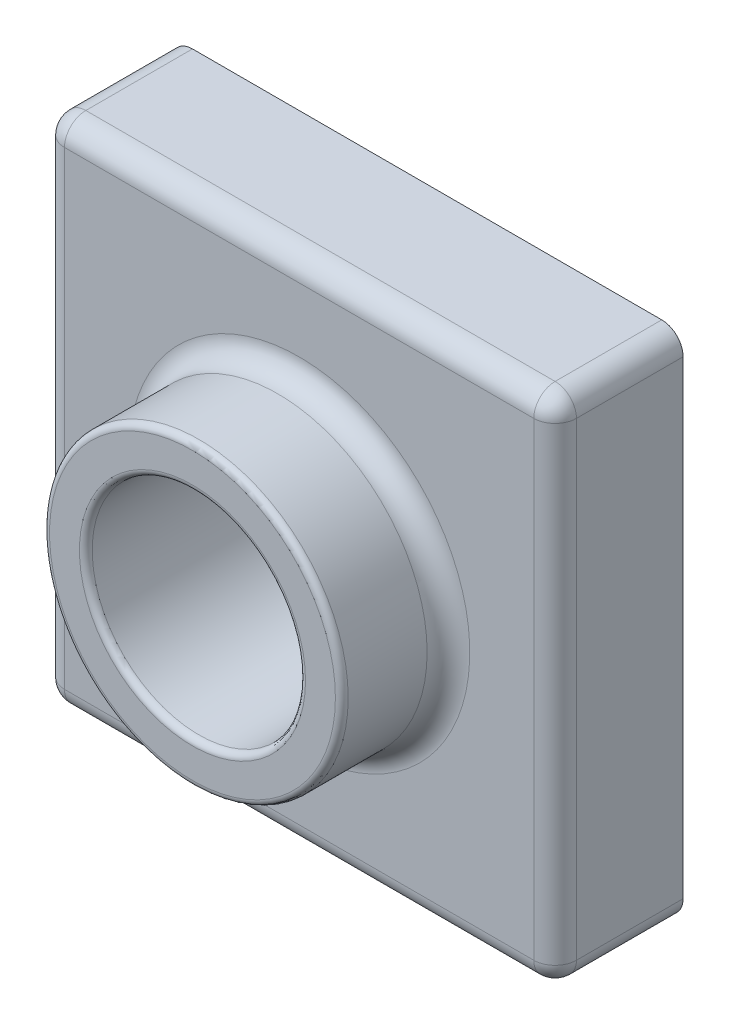
ISO-10303-21;
HEADER;
FILE_DESCRIPTION(('STEP AP214'),'2;1');
FILE_NAME('part.step','',(''),(''),'','','');
FILE_SCHEMA(('AUTOMOTIVE_DESIGN { 1 0 10303 214 1 1 1 1 }'));
ENDSEC;
DATA;
#1=APPLICATION_CONTEXT('core data for automotive mechanical design processes');
#2=APPLICATION_PROTOCOL_DEFINITION('international standard','automotive_design',2000,#1);
#3=PRODUCT_CONTEXT('',#1,'mechanical');
#4=PRODUCT('Part','Part','',(#3));
#5=PRODUCT_RELATED_PRODUCT_CATEGORY('part','',(#4));
#6=PRODUCT_DEFINITION_FORMATION('','',#4);
#7=PRODUCT_DEFINITION_CONTEXT('part definition',#1,'design');
#8=PRODUCT_DEFINITION('design','',#6,#7);
#9=PRODUCT_DEFINITION_SHAPE('','',#8);
#10=(LENGTH_UNIT() NAMED_UNIT(*) SI_UNIT(.MILLI.,.METRE.));
#11=(NAMED_UNIT(*) PLANE_ANGLE_UNIT() SI_UNIT($,.RADIAN.));
#12=(NAMED_UNIT(*) SI_UNIT($,.STERADIAN.) SOLID_ANGLE_UNIT());
#13=UNCERTAINTY_MEASURE_WITH_UNIT(LENGTH_MEASURE(1.E-05),#10,'distance_accuracy_value','');
#14=(GEOMETRIC_REPRESENTATION_CONTEXT(3) GLOBAL_UNCERTAINTY_ASSIGNED_CONTEXT((#13)) GLOBAL_UNIT_ASSIGNED_CONTEXT((#10,
#11,#12)) REPRESENTATION_CONTEXT('',''));
#15=CARTESIAN_POINT('',(0.,0.,0.));
#16=DIRECTION('',(0.,0.,1.));
#17=DIRECTION('',(1.,0.,0.));
#18=AXIS2_PLACEMENT_3D('',#15,#16,#17);
#19=CARTESIAN_POINT('',(0.,0.,0.));
#20=DIRECTION('',(0.,0.,-1.));
#21=DIRECTION('',(-1.,0.,0.));
#22=AXIS2_PLACEMENT_3D('',#19,#20,#21);
#23=PLANE('',#22);
#24=DIRECTION('',(1.,0.,0.));
#25=VECTOR('',#24,1.);
#26=CARTESIAN_POINT('',(0.,0.,0.));
#27=LINE('',#26,#25);
#28=CARTESIAN_POINT('',(5.,0.,0.));
#29=VERTEX_POINT('',#28);
#30=CARTESIAN_POINT('',(115.,0.,0.));
#31=VERTEX_POINT('',#30);
#32=EDGE_CURVE('E297',#29,#31,#27,.T.);
#33=ORIENTED_EDGE('',*,*,#32,.F.);
#34=CARTESIAN_POINT('',(5.,5.,0.));
#35=DIRECTION('',(0.,0.,-1.));
#36=DIRECTION('',(-1.,0.,0.));
#37=AXIS2_PLACEMENT_3D('',#34,#35,#36);
#38=CIRCLE('',#37,5.);
#39=CARTESIAN_POINT('',(0.,5.,0.));
#40=VERTEX_POINT('',#39);
#41=EDGE_CURVE('E351',#29,#40,#38,.T.);
#42=ORIENTED_EDGE('',*,*,#41,.T.);
#43=DIRECTION('',(0.,-1.,0.));
#44=VECTOR('',#43,1.);
#45=CARTESIAN_POINT('',(0.,0.,0.));
#46=LINE('',#45,#44);
#47=CARTESIAN_POINT('',(0.,115.,0.));
#48=VERTEX_POINT('',#47);
#49=EDGE_CURVE('E294',#48,#40,#46,.T.);
#50=ORIENTED_EDGE('',*,*,#49,.F.);
#51=CARTESIAN_POINT('',(4.99999999999997,115.,0.));
#52=DIRECTION('',(0.,0.,-1.));
#53=DIRECTION('',(-1.,0.,0.));
#54=AXIS2_PLACEMENT_3D('',#51,#52,#53);
#55=CIRCLE('',#54,5.);
#56=CARTESIAN_POINT('',(4.99999999999997,120.,0.));
#57=VERTEX_POINT('',#56);
#58=EDGE_CURVE('E347',#48,#57,#55,.T.);
#59=ORIENTED_EDGE('',*,*,#58,.T.);
#60=DIRECTION('',(-1.,0.,0.));
#61=VECTOR('',#60,1.);
#62=CARTESIAN_POINT('',(0.,120.,0.));
#63=LINE('',#62,#61);
#64=CARTESIAN_POINT('',(115.,120.,0.));
#65=VERTEX_POINT('',#64);
#66=EDGE_CURVE('E303',#65,#57,#63,.T.);
#67=ORIENTED_EDGE('',*,*,#66,.F.);
#68=CARTESIAN_POINT('',(115.,115.,0.));
#69=DIRECTION('',(0.,0.,-1.));
#70=DIRECTION('',(-1.,0.,0.));
#71=AXIS2_PLACEMENT_3D('',#68,#69,#70);
#72=CIRCLE('',#71,5.);
#73=CARTESIAN_POINT('',(120.,115.,0.));
#74=VERTEX_POINT('',#73);
#75=EDGE_CURVE('E345',#65,#74,#72,.T.);
#76=ORIENTED_EDGE('',*,*,#75,.T.);
#77=DIRECTION('',(0.,1.,0.));
#78=VECTOR('',#77,1.);
#79=CARTESIAN_POINT('',(120.,0.,0.));
#80=LINE('',#79,#78);
#81=CARTESIAN_POINT('',(120.,5.,0.));
#82=VERTEX_POINT('',#81);
#83=EDGE_CURVE('E300',#82,#74,#80,.T.);
#84=ORIENTED_EDGE('',*,*,#83,.F.);
#85=CARTESIAN_POINT('',(115.,5.,0.));
#86=DIRECTION('',(0.,0.,-1.));
#87=DIRECTION('',(-1.,0.,0.));
#88=AXIS2_PLACEMENT_3D('',#85,#86,#87);
#89=CIRCLE('',#88,5.);
#90=EDGE_CURVE('E349',#82,#31,#89,.T.);
#91=ORIENTED_EDGE('',*,*,#90,.T.);
#92=EDGE_LOOP('',(#33,#42,#50,#59,#67,#76,#84,#91));
#93=FACE_BOUND('',#92,.T.);
#94=CARTESIAN_POINT('',(5.,5.,0.));
#95=DIRECTION('',(0.,0.,-1.));
#96=DIRECTION('',(-1.,0.,0.));
#97=AXIS2_PLACEMENT_3D('',#94,#95,#96);
#98=CIRCLE('',#97,3.);
#99=CARTESIAN_POINT('',(5.,2.,0.));
#100=VERTEX_POINT('',#99);
#101=CARTESIAN_POINT('',(2.,5.,0.));
#102=VERTEX_POINT('',#101);
#103=EDGE_CURVE('E224',#100,#102,#98,.T.);
#104=ORIENTED_EDGE('',*,*,#103,.F.);
#105=DIRECTION('',(1.,0.,0.));
#106=VECTOR('',#105,1.);
#107=CARTESIAN_POINT('',(0.,2.,0.));
#108=LINE('',#107,#106);
#109=CARTESIAN_POINT('',(115.,2.,0.));
#110=VERTEX_POINT('',#109);
#111=EDGE_CURVE('E277',#100,#110,#108,.T.);
#112=ORIENTED_EDGE('',*,*,#111,.T.);
#113=CARTESIAN_POINT('',(115.,5.,0.));
#114=DIRECTION('',(0.,0.,-1.));
#115=DIRECTION('',(-1.,0.,0.));
#116=AXIS2_PLACEMENT_3D('',#113,#114,#115);
#117=CIRCLE('',#116,3.);
#118=CARTESIAN_POINT('',(118.,5.,0.));
#119=VERTEX_POINT('',#118);
#120=EDGE_CURVE('E281',#119,#110,#117,.T.);
#121=ORIENTED_EDGE('',*,*,#120,.F.);
#122=DIRECTION('',(0.,1.,0.));
#123=VECTOR('',#122,1.);
#124=CARTESIAN_POINT('',(118.,0.,0.));
#125=LINE('',#124,#123);
#126=CARTESIAN_POINT('',(118.,115.,0.));
#127=VERTEX_POINT('',#126);
#128=EDGE_CURVE('E48',#119,#127,#125,.T.);
#129=ORIENTED_EDGE('',*,*,#128,.T.);
#130=CARTESIAN_POINT('',(115.,115.,0.));
#131=DIRECTION('',(0.,0.,-1.));
#132=DIRECTION('',(-1.,0.,0.));
#133=AXIS2_PLACEMENT_3D('',#130,#131,#132);
#134=CIRCLE('',#133,3.);
#135=CARTESIAN_POINT('',(115.,118.,0.));
#136=VERTEX_POINT('',#135);
#137=EDGE_CURVE('E265',#136,#127,#134,.T.);
#138=ORIENTED_EDGE('',*,*,#137,.F.);
#139=DIRECTION('',(-1.,0.,0.));
#140=VECTOR('',#139,1.);
#141=CARTESIAN_POINT('',(0.,118.,0.));
#142=LINE('',#141,#140);
#143=CARTESIAN_POINT('',(4.99999999999997,118.,0.));
#144=VERTEX_POINT('',#143);
#145=EDGE_CURVE('E219',#136,#144,#142,.T.);
#146=ORIENTED_EDGE('',*,*,#145,.T.);
#147=CARTESIAN_POINT('',(4.99999999999997,115.,0.));
#148=DIRECTION('',(0.,0.,-1.));
#149=DIRECTION('',(-1.,0.,0.));
#150=AXIS2_PLACEMENT_3D('',#147,#148,#149);
#151=CIRCLE('',#150,3.);
#152=CARTESIAN_POINT('',(1.99999999999997,115.,0.));
#153=VERTEX_POINT('',#152);
#154=EDGE_CURVE('E284',#153,#144,#151,.T.);
#155=ORIENTED_EDGE('',*,*,#154,.F.);
#156=DIRECTION('',(0.,-1.,0.));
#157=VECTOR('',#156,1.);
#158=CARTESIAN_POINT('',(2.,0.,0.));
#159=LINE('',#158,#157);
#160=EDGE_CURVE('E276',#153,#102,#159,.T.);
#161=ORIENTED_EDGE('',*,*,#160,.T.);
#162=EDGE_LOOP('',(#104,#112,#121,#129,#138,#146,#155,#161));
#163=FACE_BOUND('',#162,.T.);
#164=ADVANCED_FACE('F33',(#93,#163),#23,.T.);
#165=CARTESIAN_POINT('',(0.,0.,30.));
#166=DIRECTION('',(0.,0.,-1.));
#167=DIRECTION('',(-1.,0.,0.));
#168=AXIS2_PLACEMENT_3D('',#165,#166,#167);
#169=PLANE('',#168);
#170=CARTESIAN_POINT('',(60.,60.,30.));
#171=DIRECTION('',(0.,0.,-1.));
#172=DIRECTION('',(-1.,0.,0.));
#173=AXIS2_PLACEMENT_3D('',#170,#171,#172);
#174=CIRCLE('',#173,40.);
#175=CARTESIAN_POINT('',(20.,60.,30.));
#176=VERTEX_POINT('',#175);
#177=EDGE_CURVE('E318',#176,#176,#174,.T.);
#178=ORIENTED_EDGE('',*,*,#177,.T.);
#179=EDGE_LOOP('',(#178));
#180=FACE_BOUND('',#179,.T.);
#181=DIRECTION('',(0.,1.,0.));
#182=VECTOR('',#181,1.);
#183=CARTESIAN_POINT('',(115.,0.,30.));
#184=LINE('',#183,#182);
#185=CARTESIAN_POINT('',(115.,5.,30.));
#186=VERTEX_POINT('',#185);
#187=CARTESIAN_POINT('',(115.,115.,30.));
#188=VERTEX_POINT('',#187);
#189=EDGE_CURVE('E313',#186,#188,#184,.T.);
#190=ORIENTED_EDGE('',*,*,#189,.T.);
#191=DIRECTION('',(-1.,0.,0.));
#192=VECTOR('',#191,1.);
#193=CARTESIAN_POINT('',(0.,115.,30.));
#194=LINE('',#193,#192);
#195=CARTESIAN_POINT('',(4.99999999999997,115.,30.));
#196=VERTEX_POINT('',#195);
#197=EDGE_CURVE('E315',#188,#196,#194,.T.);
#198=ORIENTED_EDGE('',*,*,#197,.T.);
#199=DIRECTION('',(0.,-1.,0.));
#200=VECTOR('',#199,1.);
#201=CARTESIAN_POINT('',(5.,0.,30.));
#202=LINE('',#201,#200);
#203=CARTESIAN_POINT('',(5.,5.,30.));
#204=VERTEX_POINT('',#203);
#205=EDGE_CURVE('E309',#196,#204,#202,.T.);
#206=ORIENTED_EDGE('',*,*,#205,.T.);
#207=DIRECTION('',(1.,0.,0.));
#208=VECTOR('',#207,1.);
#209=CARTESIAN_POINT('',(0.,5.,30.));
#210=LINE('',#209,#208);
#211=EDGE_CURVE('E311',#204,#186,#210,.T.);
#212=ORIENTED_EDGE('',*,*,#211,.T.);
#213=EDGE_LOOP('',(#190,#198,#206,#212));
#214=FACE_BOUND('',#213,.T.);
#215=ADVANCED_FACE('F435',(#180,#214),#169,.F.);
#216=CARTESIAN_POINT('',(0.,0.,30.));
#217=DIRECTION('',(1.,0.,0.));
#218=DIRECTION('',(0.,1.,0.));
#219=AXIS2_PLACEMENT_3D('',#216,#217,#218);
#220=PLANE('',#219);
#221=ORIENTED_EDGE('',*,*,#49,.T.);
#222=DIRECTION('',(0.,0.,-1.));
#223=VECTOR('',#222,1.);
#224=CARTESIAN_POINT('',(0.,5.,30.));
#225=LINE('',#224,#223);
#226=CARTESIAN_POINT('',(0.,5.,25.));
#227=VERTEX_POINT('',#226);
#228=EDGE_CURVE('E56',#40,#227,#225,.F.);
#229=ORIENTED_EDGE('',*,*,#228,.T.);
#230=DIRECTION('',(0.,-1.,0.));
#231=VECTOR('',#230,1.);
#232=CARTESIAN_POINT('',(0.,0.,25.));
#233=LINE('',#232,#231);
#234=CARTESIAN_POINT('',(0.,115.,25.));
#235=VERTEX_POINT('',#234);
#236=EDGE_CURVE('E342',#227,#235,#233,.F.);
#237=ORIENTED_EDGE('',*,*,#236,.T.);
#238=DIRECTION('',(0.,0.,-1.));
#239=VECTOR('',#238,1.);
#240=CARTESIAN_POINT('',(0.,115.,30.));
#241=LINE('',#240,#239);
#242=EDGE_CURVE('E340',#235,#48,#241,.T.);
#243=ORIENTED_EDGE('',*,*,#242,.T.);
#244=EDGE_LOOP('',(#221,#229,#237,#243));
#245=FACE_BOUND('',#244,.T.);
#246=ADVANCED_FACE('F440',(#245),#220,.F.);
#247=CARTESIAN_POINT('',(0.,0.,30.));
#248=DIRECTION('',(0.,1.,0.));
#249=DIRECTION('',(0.,0.,1.));
#250=AXIS2_PLACEMENT_3D('',#247,#248,#249);
#251=PLANE('',#250);
#252=DIRECTION('',(1.,0.,0.));
#253=VECTOR('',#252,1.);
#254=CARTESIAN_POINT('',(0.,0.,25.));
#255=LINE('',#254,#253);
#256=CARTESIAN_POINT('',(115.,0.,25.));
#257=VERTEX_POINT('',#256);
#258=CARTESIAN_POINT('',(5.,0.,25.));
#259=VERTEX_POINT('',#258);
#260=EDGE_CURVE('E336',#257,#259,#255,.F.);
#261=ORIENTED_EDGE('',*,*,#260,.T.);
#262=DIRECTION('',(0.,0.,-1.));
#263=VECTOR('',#262,1.);
#264=CARTESIAN_POINT('',(5.,0.,30.));
#265=LINE('',#264,#263);
#266=EDGE_CURVE('E338',#259,#29,#265,.T.);
#267=ORIENTED_EDGE('',*,*,#266,.T.);
#268=ORIENTED_EDGE('',*,*,#32,.T.);
#269=DIRECTION('',(0.,0.,-1.));
#270=VECTOR('',#269,1.);
#271=CARTESIAN_POINT('',(115.,0.,30.));
#272=LINE('',#271,#270);
#273=EDGE_CURVE('E334',#31,#257,#272,.F.);
#274=ORIENTED_EDGE('',*,*,#273,.T.);
#275=EDGE_LOOP('',(#261,#267,#268,#274));
#276=FACE_BOUND('',#275,.T.);
#277=ADVANCED_FACE('F814',(#276),#251,.F.);
#278=CARTESIAN_POINT('',(120.,0.,30.));
#279=DIRECTION('',(-1.,0.,0.));
#280=DIRECTION('',(0.,-1.,0.));
#281=AXIS2_PLACEMENT_3D('',#278,#279,#280);
#282=PLANE('',#281);
#283=DIRECTION('',(0.,1.,0.));
#284=VECTOR('',#283,1.);
#285=CARTESIAN_POINT('',(120.,0.,25.));
#286=LINE('',#285,#284);
#287=CARTESIAN_POINT('',(120.,115.,25.));
#288=VERTEX_POINT('',#287);
#289=CARTESIAN_POINT('',(120.,5.,25.));
#290=VERTEX_POINT('',#289);
#291=EDGE_CURVE('E330',#288,#290,#286,.F.);
#292=ORIENTED_EDGE('',*,*,#291,.T.);
#293=DIRECTION('',(0.,0.,-1.));
#294=VECTOR('',#293,1.);
#295=CARTESIAN_POINT('',(120.,5.,30.));
#296=LINE('',#295,#294);
#297=EDGE_CURVE('E332',#290,#82,#296,.T.);
#298=ORIENTED_EDGE('',*,*,#297,.T.);
#299=ORIENTED_EDGE('',*,*,#83,.T.);
#300=DIRECTION('',(0.,0.,-1.));
#301=VECTOR('',#300,1.);
#302=CARTESIAN_POINT('',(120.,115.,30.));
#303=LINE('',#302,#301);
#304=EDGE_CURVE('E328',#74,#288,#303,.F.);
#305=ORIENTED_EDGE('',*,*,#304,.T.);
#306=EDGE_LOOP('',(#292,#298,#299,#305));
#307=FACE_BOUND('',#306,.T.);
#308=ADVANCED_FACE('F429',(#307),#282,.F.);
#309=CARTESIAN_POINT('',(0.,120.,30.));
#310=DIRECTION('',(0.,-1.,0.));
#311=DIRECTION('',(0.,0.,-1.));
#312=AXIS2_PLACEMENT_3D('',#309,#310,#311);
#313=PLANE('',#312);
#314=ORIENTED_EDGE('',*,*,#66,.T.);
#315=DIRECTION('',(0.,0.,-1.));
#316=VECTOR('',#315,1.);
#317=CARTESIAN_POINT('',(4.99999999999997,120.,30.));
#318=LINE('',#317,#316);
#319=CARTESIAN_POINT('',(4.99999999999997,120.,25.));
#320=VERTEX_POINT('',#319);
#321=EDGE_CURVE('E326',#57,#320,#318,.F.);
#322=ORIENTED_EDGE('',*,*,#321,.T.);
#323=DIRECTION('',(-1.,0.,0.));
#324=VECTOR('',#323,1.);
#325=CARTESIAN_POINT('',(0.,120.,25.));
#326=LINE('',#325,#324);
#327=CARTESIAN_POINT('',(115.,120.,25.));
#328=VERTEX_POINT('',#327);
#329=EDGE_CURVE('E323',#320,#328,#326,.F.);
#330=ORIENTED_EDGE('',*,*,#329,.T.);
#331=DIRECTION('',(0.,0.,-1.));
#332=VECTOR('',#331,1.);
#333=CARTESIAN_POINT('',(115.,120.,30.));
#334=LINE('',#333,#332);
#335=EDGE_CURVE('E321',#328,#65,#334,.T.);
#336=ORIENTED_EDGE('',*,*,#335,.T.);
#337=EDGE_LOOP('',(#314,#322,#330,#336));
#338=FACE_BOUND('',#337,.T.);
#339=ADVANCED_FACE('F421',(#338),#313,.F.);
#340=CARTESIAN_POINT('',(60.,60.,0.));
#341=DIRECTION('',(0.,0.,-1.));
#342=DIRECTION('',(-1.,0.,0.));
#343=AXIS2_PLACEMENT_3D('',#340,#341,#342);
#344=CIRCLE('',#343,27.);
#345=CARTESIAN_POINT('',(33.,60.,0.));
#346=VERTEX_POINT('',#345);
#347=EDGE_CURVE('E248',#346,#346,#344,.F.);
#348=ORIENTED_EDGE('',*,*,#347,.F.);
#349=EDGE_LOOP('',(#348));
#350=FACE_BOUND('',#349,.T.);
#351=CARTESIAN_POINT('',(60.,60.,0.));
#352=DIRECTION('',(0.,0.,1.));
#353=DIRECTION('',(1.,0.,0.));
#354=AXIS2_PLACEMENT_3D('',#351,#352,#353);
#355=CIRCLE('',#354,25.);
#356=CARTESIAN_POINT('',(85.,60.,0.));
#357=VERTEX_POINT('',#356);
#358=EDGE_CURVE('E291',#357,#357,#355,.T.);
#359=ORIENTED_EDGE('',*,*,#358,.T.);
#360=EDGE_LOOP('',(#359));
#361=FACE_BOUND('',#360,.T.);
#362=ADVANCED_FACE('F419',(#350,#361),#23,.T.);
#363=CARTESIAN_POINT('',(60.,60.,55.));
#364=DIRECTION('',(0.,0.,-1.));
#365=DIRECTION('',(-1.,0.,0.));
#366=AXIS2_PLACEMENT_3D('',#363,#364,#365);
#367=CYLINDRICAL_SURFACE('',#366,35.);
#368=CARTESIAN_POINT('',(60.,60.,53.5));
#369=DIRECTION('',(0.,0.,1.));
#370=DIRECTION('',(1.,0.,0.));
#371=AXIS2_PLACEMENT_3D('',#368,#369,#370);
#372=CIRCLE('',#371,35.);
#373=CARTESIAN_POINT('',(95.,60.,53.5));
#374=VERTEX_POINT('',#373);
#375=EDGE_CURVE('E41',#374,#374,#372,.F.);
#376=ORIENTED_EDGE('',*,*,#375,.T.);
#377=EDGE_LOOP('',(#376));
#378=FACE_BOUND('',#377,.T.);
#379=CARTESIAN_POINT('',(60.,60.,35.));
#380=DIRECTION('',(0.,0.,-1.));
#381=DIRECTION('',(-1.,0.,0.));
#382=AXIS2_PLACEMENT_3D('',#379,#380,#381);
#383=CIRCLE('',#382,35.);
#384=CARTESIAN_POINT('',(25.,60.,35.));
#385=VERTEX_POINT('',#384);
#386=EDGE_CURVE('E306',#385,#385,#383,.F.);
#387=ORIENTED_EDGE('',*,*,#386,.T.);
#388=EDGE_LOOP('',(#387));
#389=FACE_BOUND('',#388,.T.);
#390=ADVANCED_FACE('F393',(#378,#389),#367,.T.);
#391=CARTESIAN_POINT('',(60.,60.,55.));
#392=DIRECTION('',(0.,0.,1.));
#393=DIRECTION('',(1.,0.,0.));
#394=AXIS2_PLACEMENT_3D('',#391,#392,#393);
#395=PLANE('',#394);
#396=CARTESIAN_POINT('',(60.,60.,55.));
#397=DIRECTION('',(0.,0.,1.));
#398=DIRECTION('',(1.,0.,0.));
#399=AXIS2_PLACEMENT_3D('',#396,#397,#398);
#400=CIRCLE('',#399,33.5);
#401=CARTESIAN_POINT('',(93.5,60.,55.));
#402=VERTEX_POINT('',#401);
#403=EDGE_CURVE('E388',#402,#402,#400,.T.);
#404=ORIENTED_EDGE('',*,*,#403,.T.);
#405=EDGE_LOOP('',(#404));
#406=FACE_BOUND('',#405,.T.);
#407=CARTESIAN_POINT('',(60.,60.,55.));
#408=DIRECTION('',(0.,0.,1.));
#409=DIRECTION('',(1.,0.,0.));
#410=AXIS2_PLACEMENT_3D('',#407,#408,#409);
#411=CIRCLE('',#410,26.5);
#412=CARTESIAN_POINT('',(86.5,60.,55.));
#413=VERTEX_POINT('',#412);
#414=EDGE_CURVE('E353',#413,#413,#411,.F.);
#415=ORIENTED_EDGE('',*,*,#414,.T.);
#416=EDGE_LOOP('',(#415));
#417=FACE_BOUND('',#416,.T.);
#418=ADVANCED_FACE('F402',(#406,#417),#395,.T.);
#419=CARTESIAN_POINT('',(60.,60.,0.));
#420=DIRECTION('',(0.,0.,1.));
#421=DIRECTION('',(1.,0.,0.));
#422=AXIS2_PLACEMENT_3D('',#419,#420,#421);
#423=CYLINDRICAL_SURFACE('',#422,25.);
#424=CARTESIAN_POINT('',(60.,60.,53.5));
#425=DIRECTION('',(0.,0.,1.));
#426=DIRECTION('',(1.,0.,0.));
#427=AXIS2_PLACEMENT_3D('',#424,#425,#426);
#428=CIRCLE('',#427,25.);
#429=CARTESIAN_POINT('',(85.,60.,53.5));
#430=VERTEX_POINT('',#429);
#431=EDGE_CURVE('E11',#430,#430,#428,.T.);
#432=ORIENTED_EDGE('',*,*,#431,.T.);
#433=EDGE_LOOP('',(#432));
#434=FACE_BOUND('',#433,.T.);
#435=ORIENTED_EDGE('',*,*,#358,.F.);
#436=EDGE_LOOP('',(#435));
#437=FACE_BOUND('',#436,.T.);
#438=ADVANCED_FACE('F405',(#434,#437),#423,.F.);
#439=CARTESIAN_POINT('',(60.,60.,35.));
#440=DIRECTION('',(0.,0.,-1.));
#441=DIRECTION('',(-1.,0.,0.));
#442=AXIS2_PLACEMENT_3D('',#439,#440,#441);
#443=TOROIDAL_SURFACE('',#442,40.,5.);
#444=ORIENTED_EDGE('',*,*,#177,.F.);
#445=EDGE_LOOP('',(#444));
#446=FACE_BOUND('',#445,.T.);
#447=ORIENTED_EDGE('',*,*,#386,.F.);
#448=EDGE_LOOP('',(#447));
#449=FACE_BOUND('',#448,.T.);
#450=ADVANCED_FACE('F415',(#446,#449),#443,.F.);
#451=CARTESIAN_POINT('',(115.,5.,30.));
#452=DIRECTION('',(0.,0.,-1.));
#453=DIRECTION('',(-1.,0.,0.));
#454=AXIS2_PLACEMENT_3D('',#451,#452,#453);
#455=CYLINDRICAL_SURFACE('',#454,5.);
#456=ORIENTED_EDGE('',*,*,#90,.F.);
#457=ORIENTED_EDGE('',*,*,#297,.F.);
#458=CARTESIAN_POINT('',(115.,5.,25.));
#459=DIRECTION('',(0.,0.,1.));
#460=DIRECTION('',(1.,0.,0.));
#461=AXIS2_PLACEMENT_3D('',#458,#459,#460);
#462=CIRCLE('',#461,5.);
#463=EDGE_CURVE('E295',#257,#290,#462,.T.);
#464=ORIENTED_EDGE('',*,*,#463,.F.);
#465=ORIENTED_EDGE('',*,*,#273,.F.);
#466=EDGE_LOOP('',(#456,#457,#464,#465));
#467=FACE_BOUND('',#466,.T.);
#468=ADVANCED_FACE('F783',(#467),#455,.T.);
#469=CARTESIAN_POINT('',(0.,5.,25.));
#470=DIRECTION('',(1.,0.,0.));
#471=DIRECTION('',(0.,0.,-1.));
#472=AXIS2_PLACEMENT_3D('',#469,#470,#471);
#473=CYLINDRICAL_SURFACE('',#472,5.);
#474=CARTESIAN_POINT('',(5.,5.,25.));
#475=DIRECTION('',(-1.,0.,0.));
#476=DIRECTION('',(0.,0.,1.));
#477=AXIS2_PLACEMENT_3D('',#474,#475,#476);
#478=CIRCLE('',#477,5.);
#479=EDGE_CURVE('E378',#259,#204,#478,.T.);
#480=ORIENTED_EDGE('',*,*,#479,.F.);
#481=ORIENTED_EDGE('',*,*,#260,.F.);
#482=CARTESIAN_POINT('',(115.,5.,25.));
#483=DIRECTION('',(1.,0.,0.));
#484=DIRECTION('',(0.,0.,-1.));
#485=AXIS2_PLACEMENT_3D('',#482,#483,#484);
#486=CIRCLE('',#485,5.);
#487=EDGE_CURVE('E381',#186,#257,#486,.T.);
#488=ORIENTED_EDGE('',*,*,#487,.F.);
#489=ORIENTED_EDGE('',*,*,#211,.F.);
#490=EDGE_LOOP('',(#480,#481,#488,#489));
#491=FACE_BOUND('',#490,.T.);
#492=ADVANCED_FACE('F773',(#491),#473,.T.);
#493=CARTESIAN_POINT('',(5.,5.,30.));
#494=DIRECTION('',(0.,0.,-1.));
#495=DIRECTION('',(-1.,0.,0.));
#496=AXIS2_PLACEMENT_3D('',#493,#494,#495);
#497=CYLINDRICAL_SURFACE('',#496,5.);
#498=ORIENTED_EDGE('',*,*,#41,.F.);
#499=ORIENTED_EDGE('',*,*,#266,.F.);
#500=CARTESIAN_POINT('',(5.,5.,25.));
#501=DIRECTION('',(0.,0.,1.));
#502=DIRECTION('',(1.,0.,0.));
#503=AXIS2_PLACEMENT_3D('',#500,#501,#502);
#504=CIRCLE('',#503,5.);
#505=EDGE_CURVE('E375',#227,#259,#504,.T.);
#506=ORIENTED_EDGE('',*,*,#505,.F.);
#507=ORIENTED_EDGE('',*,*,#228,.F.);
#508=EDGE_LOOP('',(#498,#499,#506,#507));
#509=FACE_BOUND('',#508,.T.);
#510=ADVANCED_FACE('F763',(#509),#497,.T.);
#511=CARTESIAN_POINT('',(115.,5.,25.));
#512=DIRECTION('',(0.,0.,1.));
#513=DIRECTION('',(1.,0.,0.));
#514=AXIS2_PLACEMENT_3D('',#511,#512,#513);
#515=SPHERICAL_SURFACE('',#514,5.);
#516=ORIENTED_EDGE('',*,*,#487,.T.);
#517=ORIENTED_EDGE('',*,*,#463,.T.);
#518=CARTESIAN_POINT('',(115.,5.,25.));
#519=DIRECTION('',(0.,-1.,0.));
#520=DIRECTION('',(1.,0.,0.));
#521=AXIS2_PLACEMENT_3D('',#518,#519,#520);
#522=CIRCLE('',#521,5.);
#523=EDGE_CURVE('E372',#186,#290,#522,.F.);
#524=ORIENTED_EDGE('',*,*,#523,.F.);
#525=EDGE_LOOP('',(#516,#517,#524));
#526=FACE_BOUND('',#525,.T.);
#527=ADVANCED_FACE('F753',(#526),#515,.T.);
#528=CARTESIAN_POINT('',(5.,5.,25.));
#529=DIRECTION('',(0.,0.,1.));
#530=DIRECTION('',(1.,0.,0.));
#531=AXIS2_PLACEMENT_3D('',#528,#529,#530);
#532=SPHERICAL_SURFACE('',#531,5.);
#533=ORIENTED_EDGE('',*,*,#505,.T.);
#534=ORIENTED_EDGE('',*,*,#479,.T.);
#535=CARTESIAN_POINT('',(5.,5.,25.));
#536=DIRECTION('',(0.,-1.,0.));
#537=DIRECTION('',(1.,0.,0.));
#538=AXIS2_PLACEMENT_3D('',#535,#536,#537);
#539=CIRCLE('',#538,5.);
#540=EDGE_CURVE('E369',#227,#204,#539,.F.);
#541=ORIENTED_EDGE('',*,*,#540,.F.);
#542=EDGE_LOOP('',(#533,#534,#541));
#543=FACE_BOUND('',#542,.T.);
#544=ADVANCED_FACE('F743',(#543),#532,.T.);
#545=CARTESIAN_POINT('',(115.,115.,30.));
#546=DIRECTION('',(0.,0.,-1.));
#547=DIRECTION('',(-1.,0.,0.));
#548=AXIS2_PLACEMENT_3D('',#545,#546,#547);
#549=CYLINDRICAL_SURFACE('',#548,5.);
#550=ORIENTED_EDGE('',*,*,#75,.F.);
#551=ORIENTED_EDGE('',*,*,#335,.F.);
#552=CARTESIAN_POINT('',(115.,115.,25.));
#553=DIRECTION('',(0.,0.,1.));
#554=DIRECTION('',(1.,0.,0.));
#555=AXIS2_PLACEMENT_3D('',#552,#553,#554);
#556=CIRCLE('',#555,5.);
#557=EDGE_CURVE('E366',#288,#328,#556,.T.);
#558=ORIENTED_EDGE('',*,*,#557,.F.);
#559=ORIENTED_EDGE('',*,*,#304,.F.);
#560=EDGE_LOOP('',(#550,#551,#558,#559));
#561=FACE_BOUND('',#560,.T.);
#562=ADVANCED_FACE('F733',(#561),#549,.T.);
#563=CARTESIAN_POINT('',(115.,0.,25.));
#564=DIRECTION('',(0.,1.,0.));
#565=DIRECTION('',(-1.,0.,0.));
#566=AXIS2_PLACEMENT_3D('',#563,#564,#565);
#567=CYLINDRICAL_SURFACE('',#566,5.);
#568=ORIENTED_EDGE('',*,*,#523,.T.);
#569=ORIENTED_EDGE('',*,*,#291,.F.);
#570=CARTESIAN_POINT('',(115.,115.,25.));
#571=DIRECTION('',(0.,1.,0.));
#572=DIRECTION('',(0.,0.,1.));
#573=AXIS2_PLACEMENT_3D('',#570,#571,#572);
#574=CIRCLE('',#573,5.);
#575=EDGE_CURVE('E363',#188,#288,#574,.T.);
#576=ORIENTED_EDGE('',*,*,#575,.F.);
#577=ORIENTED_EDGE('',*,*,#189,.F.);
#578=EDGE_LOOP('',(#568,#569,#576,#577));
#579=FACE_BOUND('',#578,.T.);
#580=ADVANCED_FACE('F723',(#579),#567,.T.);
#581=CARTESIAN_POINT('',(5.,0.,25.));
#582=DIRECTION('',(0.,-1.,0.));
#583=DIRECTION('',(1.,0.,0.));
#584=AXIS2_PLACEMENT_3D('',#581,#582,#583);
#585=CYLINDRICAL_SURFACE('',#584,5.);
#586=ORIENTED_EDGE('',*,*,#540,.T.);
#587=ORIENTED_EDGE('',*,*,#205,.F.);
#588=CARTESIAN_POINT('',(4.99999999999997,115.,25.));
#589=DIRECTION('',(0.,1.,0.));
#590=DIRECTION('',(0.,0.,1.));
#591=AXIS2_PLACEMENT_3D('',#588,#589,#590);
#592=CIRCLE('',#591,5.);
#593=EDGE_CURVE('E360',#235,#196,#592,.T.);
#594=ORIENTED_EDGE('',*,*,#593,.F.);
#595=ORIENTED_EDGE('',*,*,#236,.F.);
#596=EDGE_LOOP('',(#586,#587,#594,#595));
#597=FACE_BOUND('',#596,.T.);
#598=ADVANCED_FACE('F713',(#597),#585,.T.);
#599=CARTESIAN_POINT('',(4.99999999999997,115.,30.));
#600=DIRECTION('',(0.,0.,-1.));
#601=DIRECTION('',(-1.,0.,0.));
#602=AXIS2_PLACEMENT_3D('',#599,#600,#601);
#603=CYLINDRICAL_SURFACE('',#602,5.);
#604=ORIENTED_EDGE('',*,*,#58,.F.);
#605=ORIENTED_EDGE('',*,*,#242,.F.);
#606=CARTESIAN_POINT('',(4.99999999999997,115.,25.));
#607=DIRECTION('',(0.,0.,1.));
#608=DIRECTION('',(1.,0.,0.));
#609=AXIS2_PLACEMENT_3D('',#606,#607,#608);
#610=CIRCLE('',#609,5.);
#611=EDGE_CURVE('E357',#320,#235,#610,.T.);
#612=ORIENTED_EDGE('',*,*,#611,.F.);
#613=ORIENTED_EDGE('',*,*,#321,.F.);
#614=EDGE_LOOP('',(#604,#605,#612,#613));
#615=FACE_BOUND('',#614,.T.);
#616=ADVANCED_FACE('F703',(#615),#603,.T.);
#617=CARTESIAN_POINT('',(115.,115.,25.));
#618=DIRECTION('',(0.,0.,1.));
#619=DIRECTION('',(1.,0.,0.));
#620=AXIS2_PLACEMENT_3D('',#617,#618,#619);
#621=SPHERICAL_SURFACE('',#620,5.);
#622=ORIENTED_EDGE('',*,*,#575,.T.);
#623=ORIENTED_EDGE('',*,*,#557,.T.);
#624=CARTESIAN_POINT('',(115.,115.,25.));
#625=DIRECTION('',(1.,0.,0.));
#626=DIRECTION('',(0.,0.,-1.));
#627=AXIS2_PLACEMENT_3D('',#624,#625,#626);
#628=CIRCLE('',#627,5.);
#629=EDGE_CURVE('E355',#188,#328,#628,.F.);
#630=ORIENTED_EDGE('',*,*,#629,.F.);
#631=EDGE_LOOP('',(#622,#623,#630));
#632=FACE_BOUND('',#631,.T.);
#633=ADVANCED_FACE('F693',(#632),#621,.T.);
#634=CARTESIAN_POINT('',(4.99999999999997,115.,25.));
#635=DIRECTION('',(0.,0.,1.));
#636=DIRECTION('',(1.,0.,0.));
#637=AXIS2_PLACEMENT_3D('',#634,#635,#636);
#638=SPHERICAL_SURFACE('',#637,5.);
#639=ORIENTED_EDGE('',*,*,#611,.T.);
#640=ORIENTED_EDGE('',*,*,#593,.T.);
#641=CARTESIAN_POINT('',(4.99999999999997,115.,25.));
#642=DIRECTION('',(-1.,0.,0.));
#643=DIRECTION('',(0.,0.,1.));
#644=AXIS2_PLACEMENT_3D('',#641,#642,#643);
#645=CIRCLE('',#644,5.);
#646=EDGE_CURVE('E227',#320,#196,#645,.F.);
#647=ORIENTED_EDGE('',*,*,#646,.F.);
#648=EDGE_LOOP('',(#639,#640,#647));
#649=FACE_BOUND('',#648,.T.);
#650=ADVANCED_FACE('F683',(#649),#638,.T.);
#651=CARTESIAN_POINT('',(0.,115.,25.));
#652=DIRECTION('',(-1.,0.,0.));
#653=DIRECTION('',(0.,0.,1.));
#654=AXIS2_PLACEMENT_3D('',#651,#652,#653);
#655=CYLINDRICAL_SURFACE('',#654,5.);
#656=ORIENTED_EDGE('',*,*,#629,.T.);
#657=ORIENTED_EDGE('',*,*,#329,.F.);
#658=ORIENTED_EDGE('',*,*,#646,.T.);
#659=ORIENTED_EDGE('',*,*,#197,.F.);
#660=EDGE_LOOP('',(#656,#657,#658,#659));
#661=FACE_BOUND('',#660,.T.);
#662=ADVANCED_FACE('F399',(#661),#655,.T.);
#663=CARTESIAN_POINT('',(60.,60.,53.5));
#664=DIRECTION('',(0.,0.,1.));
#665=DIRECTION('',(1.,0.,0.));
#666=AXIS2_PLACEMENT_3D('',#663,#664,#665);
#667=TOROIDAL_SURFACE('',#666,33.5,1.5);
#668=ORIENTED_EDGE('',*,*,#375,.F.);
#669=EDGE_LOOP('',(#668));
#670=FACE_BOUND('',#669,.T.);
#671=ORIENTED_EDGE('',*,*,#403,.F.);
#672=EDGE_LOOP('',(#671));
#673=FACE_BOUND('',#672,.T.);
#674=ADVANCED_FACE('F396',(#670,#673),#667,.T.);
#675=CARTESIAN_POINT('',(60.,60.,53.5));
#676=DIRECTION('',(0.,0.,1.));
#677=DIRECTION('',(1.,0.,0.));
#678=AXIS2_PLACEMENT_3D('',#675,#676,#677);
#679=TOROIDAL_SURFACE('',#678,26.5,1.5);
#680=ORIENTED_EDGE('',*,*,#414,.F.);
#681=EDGE_LOOP('',(#680));
#682=FACE_BOUND('',#681,.T.);
#683=ORIENTED_EDGE('',*,*,#431,.F.);
#684=EDGE_LOOP('',(#683));
#685=FACE_BOUND('',#684,.T.);
#686=ADVANCED_FACE('F35',(#682,#685),#679,.T.);
#687=CARTESIAN_POINT('',(0.,0.,28.));
#688=DIRECTION('',(0.,0.,-1.));
#689=DIRECTION('',(-1.,0.,0.));
#690=AXIS2_PLACEMENT_3D('',#687,#688,#689);
#691=PLANE('',#690);
#692=CARTESIAN_POINT('',(60.,60.,28.));
#693=DIRECTION('',(0.,0.,-1.));
#694=DIRECTION('',(-1.,0.,0.));
#695=AXIS2_PLACEMENT_3D('',#692,#693,#694);
#696=CIRCLE('',#695,40.);
#697=CARTESIAN_POINT('',(20.,60.,28.));
#698=VERTEX_POINT('',#697);
#699=EDGE_CURVE('E208',#698,#698,#696,.T.);
#700=ORIENTED_EDGE('',*,*,#699,.F.);
#701=EDGE_LOOP('',(#700));
#702=FACE_BOUND('',#701,.T.);
#703=DIRECTION('',(0.,1.,0.));
#704=VECTOR('',#703,1.);
#705=CARTESIAN_POINT('',(115.,0.,28.));
#706=LINE('',#705,#704);
#707=CARTESIAN_POINT('',(115.,5.,28.));
#708=VERTEX_POINT('',#707);
#709=CARTESIAN_POINT('',(115.,115.,28.));
#710=VERTEX_POINT('',#709);
#711=EDGE_CURVE('E174',#708,#710,#706,.T.);
#712=ORIENTED_EDGE('',*,*,#711,.F.);
#713=DIRECTION('',(-1.,0.,0.));
#714=VECTOR('',#713,1.);
#715=CARTESIAN_POINT('',(0.,5.,28.));
#716=LINE('',#715,#714);
#717=CARTESIAN_POINT('',(5.,5.,28.));
#718=VERTEX_POINT('',#717);
#719=EDGE_CURVE('E184',#718,#708,#716,.F.);
#720=ORIENTED_EDGE('',*,*,#719,.F.);
#721=DIRECTION('',(0.,1.,0.));
#722=VECTOR('',#721,1.);
#723=CARTESIAN_POINT('',(4.99999999999997,0.,28.));
#724=LINE('',#723,#722);
#725=CARTESIAN_POINT('',(4.99999999999997,115.,28.));
#726=VERTEX_POINT('',#725);
#727=EDGE_CURVE('E207',#726,#718,#724,.F.);
#728=ORIENTED_EDGE('',*,*,#727,.F.);
#729=DIRECTION('',(-1.,0.,0.));
#730=VECTOR('',#729,1.);
#731=CARTESIAN_POINT('',(0.,115.,28.));
#732=LINE('',#731,#730);
#733=EDGE_CURVE('E183',#710,#726,#732,.T.);
#734=ORIENTED_EDGE('',*,*,#733,.F.);
#735=EDGE_LOOP('',(#712,#720,#728,#734));
#736=FACE_BOUND('',#735,.T.);
#737=ADVANCED_FACE('F206',(#702,#736),#691,.T.);
#738=CARTESIAN_POINT('',(2.,0.,30.));
#739=DIRECTION('',(1.,0.,0.));
#740=DIRECTION('',(0.,1.,0.));
#741=AXIS2_PLACEMENT_3D('',#738,#739,#740);
#742=PLANE('',#741);
#743=ORIENTED_EDGE('',*,*,#160,.F.);
#744=DIRECTION('',(0.,0.,1.));
#745=VECTOR('',#744,1.);
#746=CARTESIAN_POINT('',(1.99999999999997,115.,30.));
#747=LINE('',#746,#745);
#748=CARTESIAN_POINT('',(1.99999999999997,115.,25.));
#749=VERTEX_POINT('',#748);
#750=EDGE_CURVE('E241',#749,#153,#747,.F.);
#751=ORIENTED_EDGE('',*,*,#750,.F.);
#752=DIRECTION('',(0.,1.,0.));
#753=VECTOR('',#752,1.);
#754=CARTESIAN_POINT('',(2.,0.,25.));
#755=LINE('',#754,#753);
#756=CARTESIAN_POINT('',(2.,5.,25.));
#757=VERTEX_POINT('',#756);
#758=EDGE_CURVE('E260',#757,#749,#755,.T.);
#759=ORIENTED_EDGE('',*,*,#758,.F.);
#760=DIRECTION('',(0.,0.,1.));
#761=VECTOR('',#760,1.);
#762=CARTESIAN_POINT('',(2.,5.,30.));
#763=LINE('',#762,#761);
#764=EDGE_CURVE('E263',#102,#757,#763,.T.);
#765=ORIENTED_EDGE('',*,*,#764,.F.);
#766=EDGE_LOOP('',(#743,#751,#759,#765));
#767=FACE_BOUND('',#766,.T.);
#768=ADVANCED_FACE('F457',(#767),#742,.T.);
#769=CARTESIAN_POINT('',(0.,2.,30.));
#770=DIRECTION('',(0.,1.,0.));
#771=DIRECTION('',(0.,0.,1.));
#772=AXIS2_PLACEMENT_3D('',#769,#770,#771);
#773=PLANE('',#772);
#774=DIRECTION('',(1.,0.,0.));
#775=VECTOR('',#774,1.);
#776=CARTESIAN_POINT('',(0.,2.,25.));
#777=LINE('',#776,#775);
#778=CARTESIAN_POINT('',(115.,2.,25.));
#779=VERTEX_POINT('',#778);
#780=CARTESIAN_POINT('',(5.,2.,25.));
#781=VERTEX_POINT('',#780);
#782=EDGE_CURVE('E233',#779,#781,#777,.F.);
#783=ORIENTED_EDGE('',*,*,#782,.F.);
#784=DIRECTION('',(0.,0.,1.));
#785=VECTOR('',#784,1.);
#786=CARTESIAN_POINT('',(115.,2.,30.));
#787=LINE('',#786,#785);
#788=EDGE_CURVE('E236',#110,#779,#787,.T.);
#789=ORIENTED_EDGE('',*,*,#788,.F.);
#790=ORIENTED_EDGE('',*,*,#111,.F.);
#791=DIRECTION('',(0.,0.,1.));
#792=VECTOR('',#791,1.);
#793=CARTESIAN_POINT('',(5.,2.,30.));
#794=LINE('',#793,#792);
#795=EDGE_CURVE('E235',#781,#100,#794,.F.);
#796=ORIENTED_EDGE('',*,*,#795,.F.);
#797=EDGE_LOOP('',(#783,#789,#790,#796));
#798=FACE_BOUND('',#797,.T.);
#799=ADVANCED_FACE('F473',(#798),#773,.T.);
#800=CARTESIAN_POINT('',(118.,0.,30.));
#801=DIRECTION('',(-1.,0.,0.));
#802=DIRECTION('',(0.,-1.,0.));
#803=AXIS2_PLACEMENT_3D('',#800,#801,#802);
#804=PLANE('',#803);
#805=DIRECTION('',(0.,-1.,0.));
#806=VECTOR('',#805,1.);
#807=CARTESIAN_POINT('',(118.,0.,25.));
#808=LINE('',#807,#806);
#809=CARTESIAN_POINT('',(118.,115.,25.));
#810=VERTEX_POINT('',#809);
#811=CARTESIAN_POINT('',(118.,5.,25.));
#812=VERTEX_POINT('',#811);
#813=EDGE_CURVE('E245',#810,#812,#808,.T.);
#814=ORIENTED_EDGE('',*,*,#813,.F.);
#815=DIRECTION('',(0.,0.,1.));
#816=VECTOR('',#815,1.);
#817=CARTESIAN_POINT('',(118.,115.,30.));
#818=LINE('',#817,#816);
#819=EDGE_CURVE('E250',#127,#810,#818,.T.);
#820=ORIENTED_EDGE('',*,*,#819,.F.);
#821=ORIENTED_EDGE('',*,*,#128,.F.);
#822=DIRECTION('',(0.,0.,1.));
#823=VECTOR('',#822,1.);
#824=CARTESIAN_POINT('',(118.,5.,30.));
#825=LINE('',#824,#823);
#826=EDGE_CURVE('E243',#812,#119,#825,.F.);
#827=ORIENTED_EDGE('',*,*,#826,.F.);
#828=EDGE_LOOP('',(#814,#820,#821,#827));
#829=FACE_BOUND('',#828,.T.);
#830=ADVANCED_FACE('F482',(#829),#804,.T.);
#831=CARTESIAN_POINT('',(0.,118.,30.));
#832=DIRECTION('',(0.,-1.,0.));
#833=DIRECTION('',(0.,0.,-1.));
#834=AXIS2_PLACEMENT_3D('',#831,#832,#833);
#835=PLANE('',#834);
#836=ORIENTED_EDGE('',*,*,#145,.F.);
#837=DIRECTION('',(0.,0.,-1.));
#838=VECTOR('',#837,1.);
#839=CARTESIAN_POINT('',(115.,118.,30.));
#840=LINE('',#839,#838);
#841=CARTESIAN_POINT('',(115.,118.,25.));
#842=VERTEX_POINT('',#841);
#843=EDGE_CURVE('E211',#842,#136,#840,.T.);
#844=ORIENTED_EDGE('',*,*,#843,.F.);
#845=DIRECTION('',(1.,0.,0.));
#846=VECTOR('',#845,1.);
#847=CARTESIAN_POINT('',(0.,118.,25.));
#848=LINE('',#847,#846);
#849=CARTESIAN_POINT('',(4.99999999999997,118.,25.));
#850=VERTEX_POINT('',#849);
#851=EDGE_CURVE('E201',#850,#842,#848,.T.);
#852=ORIENTED_EDGE('',*,*,#851,.F.);
#853=DIRECTION('',(0.,0.,-1.));
#854=VECTOR('',#853,1.);
#855=CARTESIAN_POINT('',(4.99999999999997,118.,30.));
#856=LINE('',#855,#854);
#857=EDGE_CURVE('E252',#144,#850,#856,.F.);
#858=ORIENTED_EDGE('',*,*,#857,.F.);
#859=EDGE_LOOP('',(#836,#844,#852,#858));
#860=FACE_BOUND('',#859,.T.);
#861=ADVANCED_FACE('F484',(#860),#835,.T.);
#862=CARTESIAN_POINT('',(60.,60.,55.));
#863=DIRECTION('',(0.,0.,-1.));
#864=DIRECTION('',(-1.,0.,0.));
#865=AXIS2_PLACEMENT_3D('',#862,#863,#864);
#866=CYLINDRICAL_SURFACE('',#865,33.);
#867=CARTESIAN_POINT('',(60.,60.,53.));
#868=DIRECTION('',(0.,0.,1.));
#869=DIRECTION('',(1.,0.,0.));
#870=AXIS2_PLACEMENT_3D('',#867,#868,#869);
#871=CIRCLE('',#870,33.);
#872=CARTESIAN_POINT('',(93.,60.,53.));
#873=VERTEX_POINT('',#872);
#874=EDGE_CURVE('E220',#873,#873,#871,.T.);
#875=ORIENTED_EDGE('',*,*,#874,.T.);
#876=EDGE_LOOP('',(#875));
#877=FACE_BOUND('',#876,.T.);
#878=CARTESIAN_POINT('',(60.,60.,35.));
#879=DIRECTION('',(0.,0.,-1.));
#880=DIRECTION('',(-1.,0.,0.));
#881=AXIS2_PLACEMENT_3D('',#878,#879,#880);
#882=CIRCLE('',#881,33.);
#883=CARTESIAN_POINT('',(27.,60.,35.));
#884=VERTEX_POINT('',#883);
#885=EDGE_CURVE('E215',#884,#884,#882,.F.);
#886=ORIENTED_EDGE('',*,*,#885,.F.);
#887=EDGE_LOOP('',(#886));
#888=FACE_BOUND('',#887,.T.);
#889=ADVANCED_FACE('F490',(#877,#888),#866,.F.);
#890=CARTESIAN_POINT('',(60.,60.,53.));
#891=DIRECTION('',(0.,0.,1.));
#892=DIRECTION('',(1.,0.,0.));
#893=AXIS2_PLACEMENT_3D('',#890,#891,#892);
#894=PLANE('',#893);
#895=ORIENTED_EDGE('',*,*,#874,.F.);
#896=EDGE_LOOP('',(#895));
#897=FACE_BOUND('',#896,.T.);
#898=CARTESIAN_POINT('',(60.,60.,53.));
#899=DIRECTION('',(0.,0.,1.));
#900=DIRECTION('',(1.,0.,0.));
#901=AXIS2_PLACEMENT_3D('',#898,#899,#900);
#902=CIRCLE('',#901,27.);
#903=CARTESIAN_POINT('',(87.,60.,53.));
#904=VERTEX_POINT('',#903);
#905=EDGE_CURVE('E223',#904,#904,#902,.T.);
#906=ORIENTED_EDGE('',*,*,#905,.T.);
#907=EDGE_LOOP('',(#906));
#908=FACE_BOUND('',#907,.T.);
#909=ADVANCED_FACE('F498',(#897,#908),#894,.F.);
#910=CARTESIAN_POINT('',(60.,60.,0.));
#911=DIRECTION('',(0.,0.,1.));
#912=DIRECTION('',(1.,0.,0.));
#913=AXIS2_PLACEMENT_3D('',#910,#911,#912);
#914=CYLINDRICAL_SURFACE('',#913,27.);
#915=ORIENTED_EDGE('',*,*,#905,.F.);
#916=EDGE_LOOP('',(#915));
#917=FACE_BOUND('',#916,.T.);
#918=ORIENTED_EDGE('',*,*,#347,.T.);
#919=EDGE_LOOP('',(#918));
#920=FACE_BOUND('',#919,.T.);
#921=ADVANCED_FACE('F502',(#917,#920),#914,.T.);
#922=CARTESIAN_POINT('',(60.,60.,35.));
#923=DIRECTION('',(0.,0.,-1.));
#924=DIRECTION('',(-1.,0.,0.));
#925=AXIS2_PLACEMENT_3D('',#922,#923,#924);
#926=TOROIDAL_SURFACE('',#925,40.,7.);
#927=ORIENTED_EDGE('',*,*,#699,.T.);
#928=EDGE_LOOP('',(#927));
#929=FACE_BOUND('',#928,.T.);
#930=ORIENTED_EDGE('',*,*,#885,.T.);
#931=EDGE_LOOP('',(#930));
#932=FACE_BOUND('',#931,.T.);
#933=ADVANCED_FACE('F506',(#929,#932),#926,.T.);
#934=CARTESIAN_POINT('',(115.,5.,30.));
#935=DIRECTION('',(0.,0.,-1.));
#936=DIRECTION('',(-1.,0.,0.));
#937=AXIS2_PLACEMENT_3D('',#934,#935,#936);
#938=CYLINDRICAL_SURFACE('',#937,3.);
#939=ORIENTED_EDGE('',*,*,#120,.T.);
#940=ORIENTED_EDGE('',*,*,#788,.T.);
#941=CARTESIAN_POINT('',(115.,5.,25.));
#942=DIRECTION('',(0.,0.,1.));
#943=DIRECTION('',(1.,0.,0.));
#944=AXIS2_PLACEMENT_3D('',#941,#942,#943);
#945=CIRCLE('',#944,3.);
#946=EDGE_CURVE('E239',#779,#812,#945,.T.);
#947=ORIENTED_EDGE('',*,*,#946,.T.);
#948=ORIENTED_EDGE('',*,*,#826,.T.);
#949=EDGE_LOOP('',(#939,#940,#947,#948));
#950=FACE_BOUND('',#949,.T.);
#951=ADVANCED_FACE('F475',(#950),#938,.F.);
#952=CARTESIAN_POINT('',(0.,5.,25.));
#953=DIRECTION('',(1.,0.,0.));
#954=DIRECTION('',(0.,0.,-1.));
#955=AXIS2_PLACEMENT_3D('',#952,#953,#954);
#956=CYLINDRICAL_SURFACE('',#955,3.);
#957=CARTESIAN_POINT('',(5.,5.,25.));
#958=DIRECTION('',(-1.,0.,0.));
#959=DIRECTION('',(0.,-1.,0.));
#960=AXIS2_PLACEMENT_3D('',#957,#958,#959);
#961=CIRCLE('',#960,3.);
#962=EDGE_CURVE('E228',#781,#718,#961,.T.);
#963=ORIENTED_EDGE('',*,*,#962,.T.);
#964=ORIENTED_EDGE('',*,*,#719,.T.);
#965=CARTESIAN_POINT('',(115.,5.,25.));
#966=DIRECTION('',(-1.,0.,0.));
#967=DIRECTION('',(0.,-1.,0.));
#968=AXIS2_PLACEMENT_3D('',#965,#966,#967);
#969=CIRCLE('',#968,3.);
#970=EDGE_CURVE('E231',#708,#779,#969,.F.);
#971=ORIENTED_EDGE('',*,*,#970,.T.);
#972=ORIENTED_EDGE('',*,*,#782,.T.);
#973=EDGE_LOOP('',(#963,#964,#971,#972));
#974=FACE_BOUND('',#973,.T.);
#975=ADVANCED_FACE('F467',(#974),#956,.F.);
#976=CARTESIAN_POINT('',(5.,5.,30.));
#977=DIRECTION('',(0.,0.,-1.));
#978=DIRECTION('',(-1.,0.,0.));
#979=AXIS2_PLACEMENT_3D('',#976,#977,#978);
#980=CYLINDRICAL_SURFACE('',#979,3.);
#981=ORIENTED_EDGE('',*,*,#103,.T.);
#982=ORIENTED_EDGE('',*,*,#764,.T.);
#983=CARTESIAN_POINT('',(5.,5.,25.));
#984=DIRECTION('',(0.,0.,1.));
#985=DIRECTION('',(1.,0.,0.));
#986=AXIS2_PLACEMENT_3D('',#983,#984,#985);
#987=CIRCLE('',#986,3.);
#988=EDGE_CURVE('E232',#757,#781,#987,.T.);
#989=ORIENTED_EDGE('',*,*,#988,.T.);
#990=ORIENTED_EDGE('',*,*,#795,.T.);
#991=EDGE_LOOP('',(#981,#982,#989,#990));
#992=FACE_BOUND('',#991,.T.);
#993=ADVANCED_FACE('F452',(#992),#980,.F.);
#994=CARTESIAN_POINT('',(115.,5.,25.));
#995=DIRECTION('',(0.,0.,1.));
#996=DIRECTION('',(1.,0.,0.));
#997=AXIS2_PLACEMENT_3D('',#994,#995,#996);
#998=SPHERICAL_SURFACE('',#997,3.);
#999=ORIENTED_EDGE('',*,*,#970,.F.);
#1000=CARTESIAN_POINT('',(115.,5.,25.));
#1001=DIRECTION('',(0.,1.,0.));
#1002=DIRECTION('',(-1.,0.,0.));
#1003=AXIS2_PLACEMENT_3D('',#1000,#1001,#1002);
#1004=CIRCLE('',#1003,3.);
#1005=EDGE_CURVE('E179',#708,#812,#1004,.T.);
#1006=ORIENTED_EDGE('',*,*,#1005,.T.);
#1007=ORIENTED_EDGE('',*,*,#946,.F.);
#1008=EDGE_LOOP('',(#999,#1006,#1007));
#1009=FACE_BOUND('',#1008,.T.);
#1010=ADVANCED_FACE('F517',(#1009),#998,.F.);
#1011=CARTESIAN_POINT('',(5.,5.,25.));
#1012=DIRECTION('',(0.,0.,1.));
#1013=DIRECTION('',(1.,0.,0.));
#1014=AXIS2_PLACEMENT_3D('',#1011,#1012,#1013);
#1015=SPHERICAL_SURFACE('',#1014,3.);
#1016=ORIENTED_EDGE('',*,*,#988,.F.);
#1017=CARTESIAN_POINT('',(5.,5.,25.));
#1018=DIRECTION('',(0.,-1.,0.));
#1019=DIRECTION('',(1.,0.,0.));
#1020=AXIS2_PLACEMENT_3D('',#1017,#1018,#1019);
#1021=CIRCLE('',#1020,3.);
#1022=EDGE_CURVE('E253',#757,#718,#1021,.F.);
#1023=ORIENTED_EDGE('',*,*,#1022,.T.);
#1024=ORIENTED_EDGE('',*,*,#962,.F.);
#1025=EDGE_LOOP('',(#1016,#1023,#1024));
#1026=FACE_BOUND('',#1025,.T.);
#1027=ADVANCED_FACE('F465',(#1026),#1015,.F.);
#1028=CARTESIAN_POINT('',(115.,115.,30.));
#1029=DIRECTION('',(0.,0.,-1.));
#1030=DIRECTION('',(-1.,0.,0.));
#1031=AXIS2_PLACEMENT_3D('',#1028,#1029,#1030);
#1032=CYLINDRICAL_SURFACE('',#1031,3.);
#1033=ORIENTED_EDGE('',*,*,#137,.T.);
#1034=ORIENTED_EDGE('',*,*,#819,.T.);
#1035=CARTESIAN_POINT('',(115.,115.,25.));
#1036=DIRECTION('',(0.,0.,1.));
#1037=DIRECTION('',(1.,0.,0.));
#1038=AXIS2_PLACEMENT_3D('',#1035,#1036,#1037);
#1039=CIRCLE('',#1038,3.);
#1040=EDGE_CURVE('E192',#810,#842,#1039,.T.);
#1041=ORIENTED_EDGE('',*,*,#1040,.T.);
#1042=ORIENTED_EDGE('',*,*,#843,.T.);
#1043=EDGE_LOOP('',(#1033,#1034,#1041,#1042));
#1044=FACE_BOUND('',#1043,.T.);
#1045=ADVANCED_FACE('F479',(#1044),#1032,.F.);
#1046=CARTESIAN_POINT('',(115.,0.,25.));
#1047=DIRECTION('',(0.,1.,0.));
#1048=DIRECTION('',(-1.,0.,0.));
#1049=AXIS2_PLACEMENT_3D('',#1046,#1047,#1048);
#1050=CYLINDRICAL_SURFACE('',#1049,3.);
#1051=ORIENTED_EDGE('',*,*,#1005,.F.);
#1052=ORIENTED_EDGE('',*,*,#711,.T.);
#1053=CARTESIAN_POINT('',(115.,115.,25.));
#1054=DIRECTION('',(0.,-1.,0.));
#1055=DIRECTION('',(0.,0.,-1.));
#1056=AXIS2_PLACEMENT_3D('',#1053,#1054,#1055);
#1057=CIRCLE('',#1056,3.);
#1058=EDGE_CURVE('E177',#710,#810,#1057,.F.);
#1059=ORIENTED_EDGE('',*,*,#1058,.T.);
#1060=ORIENTED_EDGE('',*,*,#813,.T.);
#1061=EDGE_LOOP('',(#1051,#1052,#1059,#1060));
#1062=FACE_BOUND('',#1061,.T.);
#1063=ADVANCED_FACE('F176',(#1062),#1050,.F.);
#1064=CARTESIAN_POINT('',(5.,0.,25.));
#1065=DIRECTION('',(0.,-1.,0.));
#1066=DIRECTION('',(1.,0.,0.));
#1067=AXIS2_PLACEMENT_3D('',#1064,#1065,#1066);
#1068=CYLINDRICAL_SURFACE('',#1067,3.);
#1069=ORIENTED_EDGE('',*,*,#1022,.F.);
#1070=ORIENTED_EDGE('',*,*,#758,.T.);
#1071=CARTESIAN_POINT('',(4.99999999999997,115.,25.));
#1072=DIRECTION('',(0.,1.,0.));
#1073=DIRECTION('',(-1.,0.,0.));
#1074=AXIS2_PLACEMENT_3D('',#1071,#1072,#1073);
#1075=CIRCLE('',#1074,3.);
#1076=EDGE_CURVE('E193',#749,#726,#1075,.T.);
#1077=ORIENTED_EDGE('',*,*,#1076,.T.);
#1078=ORIENTED_EDGE('',*,*,#727,.T.);
#1079=EDGE_LOOP('',(#1069,#1070,#1077,#1078));
#1080=FACE_BOUND('',#1079,.T.);
#1081=ADVANCED_FACE('F462',(#1080),#1068,.F.);
#1082=CARTESIAN_POINT('',(4.99999999999997,115.,30.));
#1083=DIRECTION('',(0.,0.,-1.));
#1084=DIRECTION('',(-1.,0.,0.));
#1085=AXIS2_PLACEMENT_3D('',#1082,#1083,#1084);
#1086=CYLINDRICAL_SURFACE('',#1085,3.);
#1087=ORIENTED_EDGE('',*,*,#154,.T.);
#1088=ORIENTED_EDGE('',*,*,#857,.T.);
#1089=CARTESIAN_POINT('',(4.99999999999997,115.,25.));
#1090=DIRECTION('',(0.,0.,1.));
#1091=DIRECTION('',(1.,0.,0.));
#1092=AXIS2_PLACEMENT_3D('',#1089,#1090,#1091);
#1093=CIRCLE('',#1092,3.);
#1094=EDGE_CURVE('E202',#850,#749,#1093,.T.);
#1095=ORIENTED_EDGE('',*,*,#1094,.T.);
#1096=ORIENTED_EDGE('',*,*,#750,.T.);
#1097=EDGE_LOOP('',(#1087,#1088,#1095,#1096));
#1098=FACE_BOUND('',#1097,.T.);
#1099=ADVANCED_FACE('F529',(#1098),#1086,.F.);
#1100=CARTESIAN_POINT('',(115.,115.,25.));
#1101=DIRECTION('',(0.,0.,1.));
#1102=DIRECTION('',(1.,0.,0.));
#1103=AXIS2_PLACEMENT_3D('',#1100,#1101,#1102);
#1104=SPHERICAL_SURFACE('',#1103,3.);
#1105=ORIENTED_EDGE('',*,*,#1058,.F.);
#1106=CARTESIAN_POINT('',(115.,115.,25.));
#1107=DIRECTION('',(-1.,0.,0.));
#1108=DIRECTION('',(0.,0.,1.));
#1109=AXIS2_PLACEMENT_3D('',#1106,#1107,#1108);
#1110=CIRCLE('',#1109,3.);
#1111=EDGE_CURVE('E190',#710,#842,#1110,.T.);
#1112=ORIENTED_EDGE('',*,*,#1111,.T.);
#1113=ORIENTED_EDGE('',*,*,#1040,.F.);
#1114=EDGE_LOOP('',(#1105,#1112,#1113));
#1115=FACE_BOUND('',#1114,.T.);
#1116=ADVANCED_FACE('F189',(#1115),#1104,.F.);
#1117=CARTESIAN_POINT('',(4.99999999999997,115.,25.));
#1118=DIRECTION('',(0.,0.,1.));
#1119=DIRECTION('',(1.,0.,0.));
#1120=AXIS2_PLACEMENT_3D('',#1117,#1118,#1119);
#1121=SPHERICAL_SURFACE('',#1120,3.);
#1122=ORIENTED_EDGE('',*,*,#1094,.F.);
#1123=CARTESIAN_POINT('',(4.99999999999997,115.,25.));
#1124=DIRECTION('',(-1.,0.,0.));
#1125=DIRECTION('',(0.,0.,1.));
#1126=AXIS2_PLACEMENT_3D('',#1123,#1124,#1125);
#1127=CIRCLE('',#1126,3.);
#1128=EDGE_CURVE('E203',#850,#726,#1127,.F.);
#1129=ORIENTED_EDGE('',*,*,#1128,.T.);
#1130=ORIENTED_EDGE('',*,*,#1076,.F.);
#1131=EDGE_LOOP('',(#1122,#1129,#1130));
#1132=FACE_BOUND('',#1131,.T.);
#1133=ADVANCED_FACE('F535',(#1132),#1121,.F.);
#1134=CARTESIAN_POINT('',(0.,115.,25.));
#1135=DIRECTION('',(-1.,0.,0.));
#1136=DIRECTION('',(0.,0.,1.));
#1137=AXIS2_PLACEMENT_3D('',#1134,#1135,#1136);
#1138=CYLINDRICAL_SURFACE('',#1137,3.);
#1139=ORIENTED_EDGE('',*,*,#1111,.F.);
#1140=ORIENTED_EDGE('',*,*,#733,.T.);
#1141=ORIENTED_EDGE('',*,*,#1128,.F.);
#1142=ORIENTED_EDGE('',*,*,#851,.T.);
#1143=EDGE_LOOP('',(#1139,#1140,#1141,#1142));
#1144=FACE_BOUND('',#1143,.T.);
#1145=ADVANCED_FACE('F198',(#1144),#1138,.F.);
#1146=CLOSED_SHELL('',(#164,#215,#246,#277,#308,#339,#362,#390,#418,#438,#450,#468,#492,#510,
#527,#544,#562,#580,#598,#616,#633,#650,#662,#674,#686,#737,#768,#799,#830,#861,#889,#909,#921,
#933,#951,#975,#993,#1010,#1027,#1045,#1063,#1081,#1099,#1116,#1133,#1145));
#1147=MANIFOLD_SOLID_BREP('B2',#1146);
#1148=ADVANCED_BREP_SHAPE_REPRESENTATION('',(#18,#1147),#14);
#1149=SHAPE_DEFINITION_REPRESENTATION(#9,#1148);
ENDSEC;
END-ISO-10303-21;
